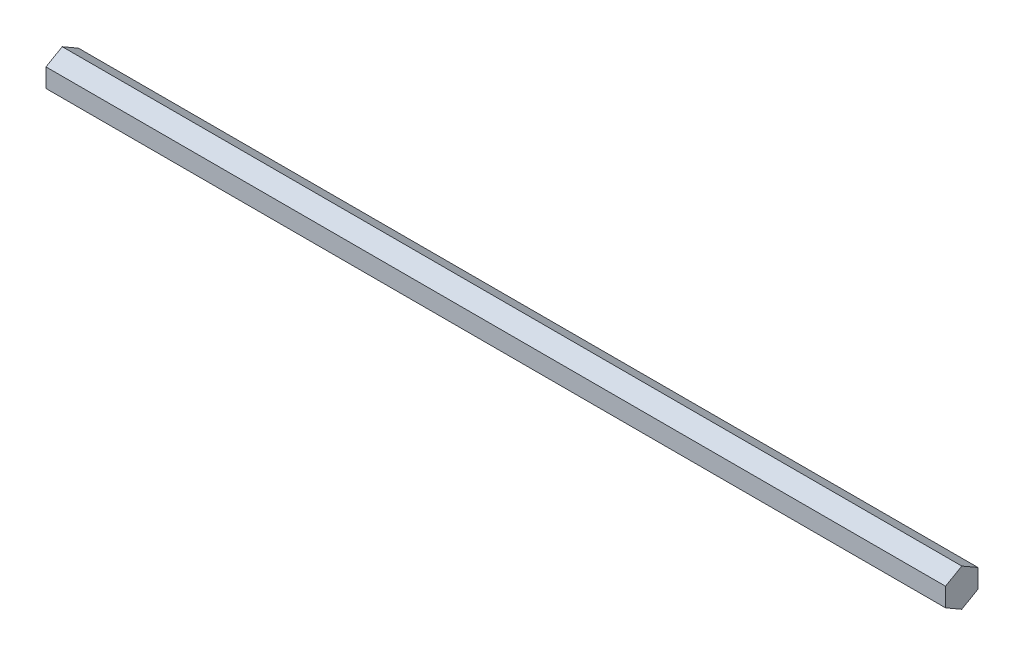
ISO-10303-21;
HEADER;
FILE_DESCRIPTION(('STEP AP214'),'2;1');
FILE_NAME('part.step','',(''),(''),'','','');
FILE_SCHEMA(('AUTOMOTIVE_DESIGN { 1 0 10303 214 1 1 1 1 }'));
ENDSEC;
DATA;
#1=APPLICATION_CONTEXT('core data for automotive mechanical design processes');
#2=APPLICATION_PROTOCOL_DEFINITION('international standard','automotive_design',2000,#1);
#3=PRODUCT_CONTEXT('',#1,'mechanical');
#4=PRODUCT('Part','Part','',(#3));
#5=PRODUCT_RELATED_PRODUCT_CATEGORY('part','',(#4));
#6=PRODUCT_DEFINITION_FORMATION('','',#4);
#7=PRODUCT_DEFINITION_CONTEXT('part definition',#1,'design');
#8=PRODUCT_DEFINITION('design','',#6,#7);
#9=PRODUCT_DEFINITION_SHAPE('','',#8);
#10=(LENGTH_UNIT() NAMED_UNIT(*) SI_UNIT(.MILLI.,.METRE.));
#11=(NAMED_UNIT(*) PLANE_ANGLE_UNIT() SI_UNIT($,.RADIAN.));
#12=(NAMED_UNIT(*) SI_UNIT($,.STERADIAN.) SOLID_ANGLE_UNIT());
#13=UNCERTAINTY_MEASURE_WITH_UNIT(LENGTH_MEASURE(1.E-05),#10,'distance_accuracy_value','');
#14=(GEOMETRIC_REPRESENTATION_CONTEXT(3) GLOBAL_UNCERTAINTY_ASSIGNED_CONTEXT((#13)) GLOBAL_UNIT_ASSIGNED_CONTEXT((#10,
#11,#12)) REPRESENTATION_CONTEXT('',''));
#15=CARTESIAN_POINT('',(0.,0.,0.));
#16=DIRECTION('',(0.,0.,1.));
#17=DIRECTION('',(1.,0.,0.));
#18=AXIS2_PLACEMENT_3D('',#15,#16,#17);
#19=CARTESIAN_POINT('',(228.6,-4.7625,0.));
#20=DIRECTION('',(0.,0.866025403784439,0.5));
#21=DIRECTION('',(0.,-0.5,0.866025403784439));
#22=AXIS2_PLACEMENT_3D('',#19,#20,#21);
#23=PLANE('',#22);
#24=DIRECTION('',(0.,0.499999999999999,-0.866025403784439));
#25=VECTOR('',#24,1.);
#26=CARTESIAN_POINT('',(0.,-4.7625,0.));
#27=LINE('',#26,#25);
#28=CARTESIAN_POINT('',(0.,-4.7625,0.));
#29=VERTEX_POINT('',#28);
#30=CARTESIAN_POINT('',(0.,-2.38125,-4.12444598552339));
#31=VERTEX_POINT('',#30);
#32=EDGE_CURVE('E146',#29,#31,#27,.T.);
#33=ORIENTED_EDGE('',*,*,#32,.T.);
#34=DIRECTION('',(-1.,0.,0.));
#35=VECTOR('',#34,1.);
#36=CARTESIAN_POINT('',(228.6,-2.38125,-4.12444598552339));
#37=LINE('',#36,#35);
#38=CARTESIAN_POINT('',(228.6,-2.38125,-4.12444598552339));
#39=VERTEX_POINT('',#38);
#40=EDGE_CURVE('E11',#39,#31,#37,.T.);
#41=ORIENTED_EDGE('',*,*,#40,.F.);
#42=DIRECTION('',(0.,0.499999999999999,-0.866025403784439));
#43=VECTOR('',#42,1.);
#44=CARTESIAN_POINT('',(228.6,-4.7625,0.));
#45=LINE('',#44,#43);
#46=CARTESIAN_POINT('',(228.6,-4.7625,0.));
#47=VERTEX_POINT('',#46);
#48=EDGE_CURVE('E164',#47,#39,#45,.T.);
#49=ORIENTED_EDGE('',*,*,#48,.F.);
#50=DIRECTION('',(-1.,0.,0.));
#51=VECTOR('',#50,1.);
#52=CARTESIAN_POINT('',(228.6,-4.7625,0.));
#53=LINE('',#52,#51);
#54=EDGE_CURVE('E142',#47,#29,#53,.T.);
#55=ORIENTED_EDGE('',*,*,#54,.T.);
#56=EDGE_LOOP('',(#33,#41,#49,#55));
#57=FACE_BOUND('',#56,.T.);
#58=ADVANCED_FACE('F45',(#57),#23,.F.);
#59=CARTESIAN_POINT('',(228.6,-2.38125,-4.12444598552339));
#60=DIRECTION('',(0.,0.,1.));
#61=DIRECTION('',(1.,0.,0.));
#62=AXIS2_PLACEMENT_3D('',#59,#60,#61);
#63=PLANE('',#62);
#64=DIRECTION('',(0.,1.,0.));
#65=VECTOR('',#64,1.);
#66=CARTESIAN_POINT('',(0.,-2.38125,-4.12444598552339));
#67=LINE('',#66,#65);
#68=CARTESIAN_POINT('',(0.,2.38125,-4.12444598552339));
#69=VERTEX_POINT('',#68);
#70=EDGE_CURVE('E150',#31,#69,#67,.T.);
#71=ORIENTED_EDGE('',*,*,#70,.T.);
#72=DIRECTION('',(-1.,0.,0.));
#73=VECTOR('',#72,1.);
#74=CARTESIAN_POINT('',(228.6,2.38125,-4.12444598552339));
#75=LINE('',#74,#73);
#76=CARTESIAN_POINT('',(228.6,2.38125,-4.12444598552339));
#77=VERTEX_POINT('',#76);
#78=EDGE_CURVE('E53',#77,#69,#75,.T.);
#79=ORIENTED_EDGE('',*,*,#78,.F.);
#80=DIRECTION('',(0.,1.,0.));
#81=VECTOR('',#80,1.);
#82=CARTESIAN_POINT('',(228.6,-2.38125,-4.12444598552339));
#83=LINE('',#82,#81);
#84=EDGE_CURVE('E104',#39,#77,#83,.T.);
#85=ORIENTED_EDGE('',*,*,#84,.F.);
#86=ORIENTED_EDGE('',*,*,#40,.T.);
#87=EDGE_LOOP('',(#71,#79,#85,#86));
#88=FACE_BOUND('',#87,.T.);
#89=ADVANCED_FACE('F228',(#88),#63,.F.);
#90=CARTESIAN_POINT('',(228.6,2.38125,-4.12444598552339));
#91=DIRECTION('',(0.,-0.866025403784439,0.5));
#92=DIRECTION('',(0.,-0.5,-0.866025403784439));
#93=AXIS2_PLACEMENT_3D('',#90,#91,#92);
#94=PLANE('',#93);
#95=DIRECTION('',(0.,0.5,0.866025403784439));
#96=VECTOR('',#95,1.);
#97=CARTESIAN_POINT('',(0.,2.38125,-4.12444598552339));
#98=LINE('',#97,#96);
#99=CARTESIAN_POINT('',(0.,4.7625,0.));
#100=VERTEX_POINT('',#99);
#101=EDGE_CURVE('E154',#69,#100,#98,.T.);
#102=ORIENTED_EDGE('',*,*,#101,.T.);
#103=DIRECTION('',(-1.,0.,0.));
#104=VECTOR('',#103,1.);
#105=CARTESIAN_POINT('',(228.6,4.7625,0.));
#106=LINE('',#105,#104);
#107=CARTESIAN_POINT('',(228.6,4.7625,0.));
#108=VERTEX_POINT('',#107);
#109=EDGE_CURVE('E135',#108,#100,#106,.T.);
#110=ORIENTED_EDGE('',*,*,#109,.F.);
#111=DIRECTION('',(0.,0.5,0.866025403784439));
#112=VECTOR('',#111,1.);
#113=CARTESIAN_POINT('',(228.6,2.38125,-4.12444598552339));
#114=LINE('',#113,#112);
#115=EDGE_CURVE('E121',#77,#108,#114,.T.);
#116=ORIENTED_EDGE('',*,*,#115,.F.);
#117=ORIENTED_EDGE('',*,*,#78,.T.);
#118=EDGE_LOOP('',(#102,#110,#116,#117));
#119=FACE_BOUND('',#118,.T.);
#120=ADVANCED_FACE('F174',(#119),#94,.F.);
#121=CARTESIAN_POINT('',(228.6,4.7625,0.));
#122=DIRECTION('',(0.,-0.866025403784439,-0.5));
#123=DIRECTION('',(0.,0.5,-0.866025403784439));
#124=AXIS2_PLACEMENT_3D('',#121,#122,#123);
#125=PLANE('',#124);
#126=DIRECTION('',(0.,-0.5,0.866025403784439));
#127=VECTOR('',#126,1.);
#128=CARTESIAN_POINT('',(0.,4.7625,0.));
#129=LINE('',#128,#127);
#130=CARTESIAN_POINT('',(0.,2.38125,4.12444598552339));
#131=VERTEX_POINT('',#130);
#132=EDGE_CURVE('E131',#100,#131,#129,.T.);
#133=ORIENTED_EDGE('',*,*,#132,.T.);
#134=DIRECTION('',(-1.,0.,0.));
#135=VECTOR('',#134,1.);
#136=CARTESIAN_POINT('',(228.6,2.38125,4.12444598552339));
#137=LINE('',#136,#135);
#138=CARTESIAN_POINT('',(228.6,2.38125,4.12444598552339));
#139=VERTEX_POINT('',#138);
#140=EDGE_CURVE('E128',#139,#131,#137,.T.);
#141=ORIENTED_EDGE('',*,*,#140,.F.);
#142=DIRECTION('',(0.,-0.5,0.866025403784439));
#143=VECTOR('',#142,1.);
#144=CARTESIAN_POINT('',(228.6,4.7625,0.));
#145=LINE('',#144,#143);
#146=EDGE_CURVE('E114',#108,#139,#145,.T.);
#147=ORIENTED_EDGE('',*,*,#146,.F.);
#148=ORIENTED_EDGE('',*,*,#109,.T.);
#149=EDGE_LOOP('',(#133,#141,#147,#148));
#150=FACE_BOUND('',#149,.T.);
#151=ADVANCED_FACE('F129',(#150),#125,.F.);
#152=CARTESIAN_POINT('',(228.6,2.38125,4.12444598552339));
#153=DIRECTION('',(0.,0.,-1.));
#154=DIRECTION('',(-1.,0.,0.));
#155=AXIS2_PLACEMENT_3D('',#152,#153,#154);
#156=PLANE('',#155);
#157=DIRECTION('',(0.,-1.,0.));
#158=VECTOR('',#157,1.);
#159=CARTESIAN_POINT('',(0.,2.38125,4.12444598552339));
#160=LINE('',#159,#158);
#161=CARTESIAN_POINT('',(0.,-2.38125,4.12444598552339));
#162=VERTEX_POINT('',#161);
#163=EDGE_CURVE('E159',#131,#162,#160,.T.);
#164=ORIENTED_EDGE('',*,*,#163,.T.);
#165=DIRECTION('',(-1.,0.,0.));
#166=VECTOR('',#165,1.);
#167=CARTESIAN_POINT('',(228.6,-2.38125,4.12444598552339));
#168=LINE('',#167,#166);
#169=CARTESIAN_POINT('',(228.6,-2.38125,4.12444598552339));
#170=VERTEX_POINT('',#169);
#171=EDGE_CURVE('E136',#170,#162,#168,.T.);
#172=ORIENTED_EDGE('',*,*,#171,.F.);
#173=DIRECTION('',(0.,-1.,0.));
#174=VECTOR('',#173,1.);
#175=CARTESIAN_POINT('',(228.6,2.38125,4.12444598552339));
#176=LINE('',#175,#174);
#177=EDGE_CURVE('E118',#139,#170,#176,.T.);
#178=ORIENTED_EDGE('',*,*,#177,.F.);
#179=ORIENTED_EDGE('',*,*,#140,.T.);
#180=EDGE_LOOP('',(#164,#172,#178,#179));
#181=FACE_BOUND('',#180,.T.);
#182=ADVANCED_FACE('F138',(#181),#156,.F.);
#183=CARTESIAN_POINT('',(228.6,-2.38125,4.12444598552339));
#184=DIRECTION('',(0.,0.866025403784439,-0.5));
#185=DIRECTION('',(0.,0.5,0.866025403784439));
#186=AXIS2_PLACEMENT_3D('',#183,#184,#185);
#187=PLANE('',#186);
#188=DIRECTION('',(0.,-0.5,-0.866025403784439));
#189=VECTOR('',#188,1.);
#190=CARTESIAN_POINT('',(0.,-2.38125,4.12444598552339));
#191=LINE('',#190,#189);
#192=EDGE_CURVE('E96',#162,#29,#191,.T.);
#193=ORIENTED_EDGE('',*,*,#192,.T.);
#194=ORIENTED_EDGE('',*,*,#54,.F.);
#195=DIRECTION('',(0.,-0.5,-0.866025403784439));
#196=VECTOR('',#195,1.);
#197=CARTESIAN_POINT('',(228.6,-2.38125,4.12444598552339));
#198=LINE('',#197,#196);
#199=EDGE_CURVE('E69',#170,#47,#198,.T.);
#200=ORIENTED_EDGE('',*,*,#199,.F.);
#201=ORIENTED_EDGE('',*,*,#171,.T.);
#202=EDGE_LOOP('',(#193,#194,#200,#201));
#203=FACE_BOUND('',#202,.T.);
#204=ADVANCED_FACE('F178',(#203),#187,.F.);
#205=CARTESIAN_POINT('',(228.6,0.,0.));
#206=DIRECTION('',(1.,0.,0.));
#207=DIRECTION('',(0.,0.,-1.));
#208=AXIS2_PLACEMENT_3D('',#205,#206,#207);
#209=PLANE('',#208);
#210=ORIENTED_EDGE('',*,*,#48,.T.);
#211=ORIENTED_EDGE('',*,*,#84,.T.);
#212=ORIENTED_EDGE('',*,*,#115,.T.);
#213=ORIENTED_EDGE('',*,*,#146,.T.);
#214=ORIENTED_EDGE('',*,*,#177,.T.);
#215=ORIENTED_EDGE('',*,*,#199,.T.);
#216=EDGE_LOOP('',(#210,#211,#212,#213,#214,#215));
#217=FACE_BOUND('',#216,.T.);
#218=ADVANCED_FACE('F116',(#217),#209,.T.);
#219=CARTESIAN_POINT('',(0.,0.,0.));
#220=DIRECTION('',(1.,0.,0.));
#221=DIRECTION('',(0.,0.,-1.));
#222=AXIS2_PLACEMENT_3D('',#219,#220,#221);
#223=PLANE('',#222);
#224=DIRECTION('',(0.,0.,-1.));
#225=VECTOR('',#224,1.);
#226=CARTESIAN_POINT('',(0.,2.4892,-1.66945835527575));
#227=LINE('',#226,#225);
#228=CARTESIAN_POINT('',(0.,2.4892,1.66945835527575));
#229=VERTEX_POINT('',#228);
#230=CARTESIAN_POINT('',(0.,2.4892,-1.66945835527575));
#231=VERTEX_POINT('',#230);
#232=EDGE_CURVE('E194',#229,#231,#227,.T.);
#233=ORIENTED_EDGE('',*,*,#232,.F.);
#234=CARTESIAN_POINT('',(0.,0.,0.));
#235=DIRECTION('',(-1.,0.,0.));
#236=DIRECTION('',(0.,0.,1.));
#237=AXIS2_PLACEMENT_3D('',#234,#235,#236);
#238=CIRCLE('',#237,2.9972);
#239=EDGE_CURVE('E60',#231,#229,#238,.T.);
#240=ORIENTED_EDGE('',*,*,#239,.F.);
#241=EDGE_LOOP('',(#233,#240));
#242=FACE_BOUND('',#241,.T.);
#243=ORIENTED_EDGE('',*,*,#32,.F.);
#244=ORIENTED_EDGE('',*,*,#192,.F.);
#245=ORIENTED_EDGE('',*,*,#163,.F.);
#246=ORIENTED_EDGE('',*,*,#132,.F.);
#247=ORIENTED_EDGE('',*,*,#101,.F.);
#248=ORIENTED_EDGE('',*,*,#70,.F.);
#249=EDGE_LOOP('',(#243,#244,#245,#246,#247,#248));
#250=FACE_BOUND('',#249,.T.);
#251=ADVANCED_FACE('F177',(#242,#250),#223,.F.);
#252=CARTESIAN_POINT('',(13.97,0.,0.));
#253=DIRECTION('',(-1.,0.,0.));
#254=DIRECTION('',(0.,0.,1.));
#255=AXIS2_PLACEMENT_3D('',#252,#253,#254);
#256=CYLINDRICAL_SURFACE('',#255,2.9972);
#257=ORIENTED_EDGE('',*,*,#239,.T.);
#258=DIRECTION('',(-1.,0.,0.));
#259=VECTOR('',#258,1.);
#260=CARTESIAN_POINT('',(13.97,2.4892,1.66945835527575));
#261=LINE('',#260,#259);
#262=CARTESIAN_POINT('',(13.97,2.4892,1.66945835527575));
#263=VERTEX_POINT('',#262);
#264=EDGE_CURVE('E187',#263,#229,#261,.T.);
#265=ORIENTED_EDGE('',*,*,#264,.F.);
#266=CARTESIAN_POINT('',(13.97,0.,0.));
#267=DIRECTION('',(-1.,0.,0.));
#268=DIRECTION('',(0.,0.,1.));
#269=AXIS2_PLACEMENT_3D('',#266,#267,#268);
#270=CIRCLE('',#269,2.9972);
#271=CARTESIAN_POINT('',(13.97,2.4892,-1.66945835527575));
#272=VERTEX_POINT('',#271);
#273=EDGE_CURVE('E198',#272,#263,#270,.T.);
#274=ORIENTED_EDGE('',*,*,#273,.F.);
#275=DIRECTION('',(-1.,0.,0.));
#276=VECTOR('',#275,1.);
#277=CARTESIAN_POINT('',(13.97,2.4892,-1.66945835527575));
#278=LINE('',#277,#276);
#279=EDGE_CURVE('E151',#272,#231,#278,.T.);
#280=ORIENTED_EDGE('',*,*,#279,.T.);
#281=EDGE_LOOP('',(#257,#265,#274,#280));
#282=FACE_BOUND('',#281,.T.);
#283=ADVANCED_FACE('F216',(#282),#256,.F.);
#284=CARTESIAN_POINT('',(13.97,2.4892,-1.66945835527575));
#285=DIRECTION('',(0.,1.,0.));
#286=DIRECTION('',(0.,0.,1.));
#287=AXIS2_PLACEMENT_3D('',#284,#285,#286);
#288=PLANE('',#287);
#289=ORIENTED_EDGE('',*,*,#232,.T.);
#290=ORIENTED_EDGE('',*,*,#279,.F.);
#291=DIRECTION('',(0.,0.,-1.));
#292=VECTOR('',#291,1.);
#293=CARTESIAN_POINT('',(13.97,2.4892,-1.66945835527575));
#294=LINE('',#293,#292);
#295=EDGE_CURVE('E191',#263,#272,#294,.T.);
#296=ORIENTED_EDGE('',*,*,#295,.F.);
#297=ORIENTED_EDGE('',*,*,#264,.T.);
#298=EDGE_LOOP('',(#289,#290,#296,#297));
#299=FACE_BOUND('',#298,.T.);
#300=ADVANCED_FACE('F214',(#299),#288,.F.);
#301=CARTESIAN_POINT('',(13.97,0.,0.));
#302=DIRECTION('',(-1.,0.,0.));
#303=DIRECTION('',(0.,0.,1.));
#304=AXIS2_PLACEMENT_3D('',#301,#302,#303);
#305=PLANE('',#304);
#306=ORIENTED_EDGE('',*,*,#273,.T.);
#307=ORIENTED_EDGE('',*,*,#295,.T.);
#308=EDGE_LOOP('',(#306,#307));
#309=FACE_BOUND('',#308,.T.);
#310=ADVANCED_FACE('F210',(#309),#305,.T.);
#311=CLOSED_SHELL('',(#58,#89,#120,#151,#182,#204,#218,#251,#283,#300,#310));
#312=MANIFOLD_SOLID_BREP('B2',#311);
#313=ADVANCED_BREP_SHAPE_REPRESENTATION('',(#18,#312),#14);
#314=SHAPE_DEFINITION_REPRESENTATION(#9,#313);
ENDSEC;
END-ISO-10303-21;
